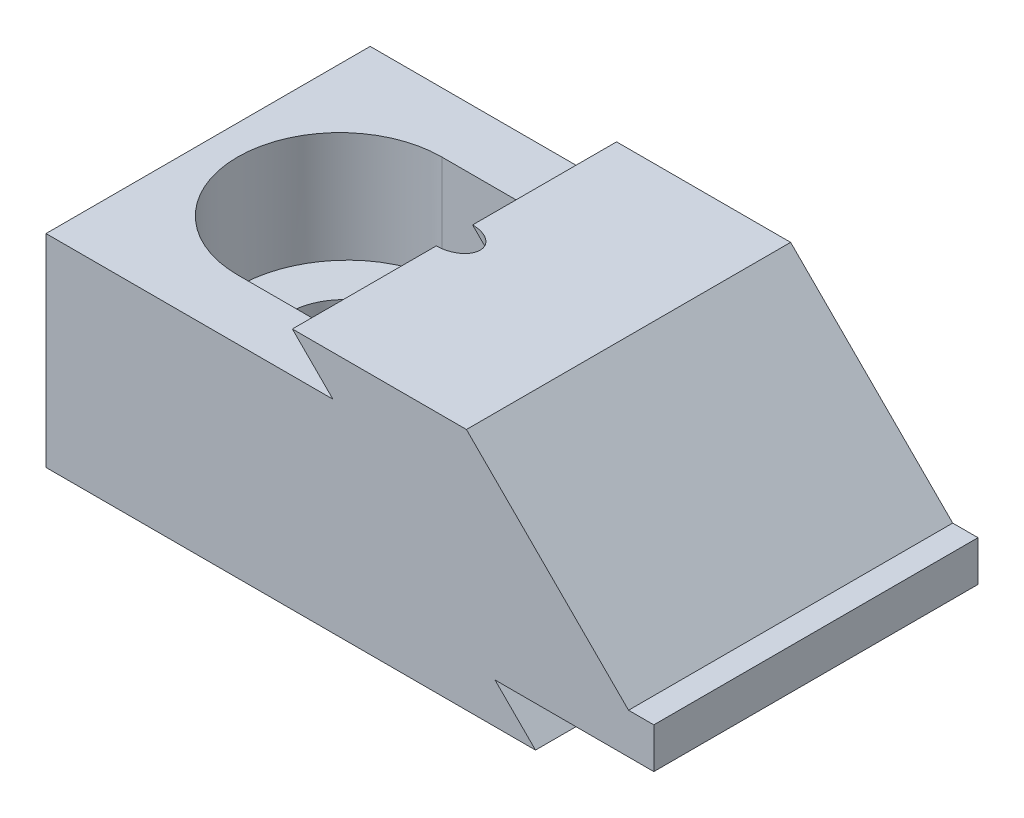
ISO-10303-21;
HEADER;
FILE_DESCRIPTION(('STEP AP214'),'2;1');
FILE_NAME('part.step','',(''),(''),'','','');
FILE_SCHEMA(('AUTOMOTIVE_DESIGN { 1 0 10303 214 1 1 1 1 }'));
ENDSEC;
DATA;
#1=APPLICATION_CONTEXT('core data for automotive mechanical design processes');
#2=APPLICATION_PROTOCOL_DEFINITION('international standard','automotive_design',2000,#1);
#3=PRODUCT_CONTEXT('',#1,'mechanical');
#4=PRODUCT('Part','Part','',(#3));
#5=PRODUCT_RELATED_PRODUCT_CATEGORY('part','',(#4));
#6=PRODUCT_DEFINITION_FORMATION('','',#4);
#7=PRODUCT_DEFINITION_CONTEXT('part definition',#1,'design');
#8=PRODUCT_DEFINITION('design','',#6,#7);
#9=PRODUCT_DEFINITION_SHAPE('','',#8);
#10=(LENGTH_UNIT() NAMED_UNIT(*) SI_UNIT(.MILLI.,.METRE.));
#11=(NAMED_UNIT(*) PLANE_ANGLE_UNIT() SI_UNIT($,.RADIAN.));
#12=(NAMED_UNIT(*) SI_UNIT($,.STERADIAN.) SOLID_ANGLE_UNIT());
#13=UNCERTAINTY_MEASURE_WITH_UNIT(LENGTH_MEASURE(1.E-05),#10,'distance_accuracy_value','');
#14=(GEOMETRIC_REPRESENTATION_CONTEXT(3) GLOBAL_UNCERTAINTY_ASSIGNED_CONTEXT((#13)) GLOBAL_UNIT_ASSIGNED_CONTEXT((#10,
#11,#12)) REPRESENTATION_CONTEXT('',''));
#15=CARTESIAN_POINT('',(0.,0.,0.));
#16=DIRECTION('',(0.,0.,1.));
#17=DIRECTION('',(1.,0.,0.));
#18=AXIS2_PLACEMENT_3D('',#15,#16,#17);
#19=CARTESIAN_POINT('',(39.3169802270047,-10.4879802270047,9.52499999999989));
#20=DIRECTION('',(-0.707106781186547,-0.707106781186548,0.));
#21=DIRECTION('',(-0.707106781186548,0.707106781186547,0.));
#22=AXIS2_PLACEMENT_3D('',#19,#20,#21);
#23=PLANE('',#22);
#24=DIRECTION('',(0.707106781186548,-0.707106781186547,0.));
#25=VECTOR('',#24,1.);
#26=CARTESIAN_POINT('',(9.65199999999986,19.1770000000001,8.1026000000002));
#27=LINE('',#26,#25);
#28=CARTESIAN_POINT('',(19.304,9.52500000000002,8.1026000000001));
#29=VERTEX_POINT('',#28);
#30=CARTESIAN_POINT('',(24.5359493419423,4.29305065805775,8.10260000000004));
#31=VERTEX_POINT('',#30);
#32=EDGE_CURVE('E520',#29,#31,#27,.T.);
#33=ORIENTED_EDGE('',*,*,#32,.F.);
#34=DIRECTION('',(0.,0.,1.));
#35=VECTOR('',#34,1.);
#36=CARTESIAN_POINT('',(19.304,9.525,9.5250000000001));
#37=LINE('',#36,#35);
#38=CARTESIAN_POINT('',(19.304,9.52500000000013,-3.1749999999999));
#39=VERTEX_POINT('',#38);
#40=EDGE_CURVE('E411',#39,#29,#37,.T.);
#41=ORIENTED_EDGE('',*,*,#40,.F.);
#42=DIRECTION('',(-0.707106781186548,0.707106781186547,0.));
#43=VECTOR('',#42,1.);
#44=CARTESIAN_POINT('',(33.2157401135023,-4.3867401135022,-3.17500000000005));
#45=LINE('',#44,#43);
#46=CARTESIAN_POINT('',(22.479,6.35000000000013,-3.17499999999993));
#47=VERTEX_POINT('',#46);
#48=EDGE_CURVE('E301',#47,#39,#45,.T.);
#49=ORIENTED_EDGE('',*,*,#48,.F.);
#50=DIRECTION('',(0.,0.,1.));
#51=VECTOR('',#50,1.);
#52=CARTESIAN_POINT('',(22.479,6.35,9.52500000000007));
#53=LINE('',#52,#51);
#54=CARTESIAN_POINT('',(22.479,6.35000000000006,4.03107922882035));
#55=VERTEX_POINT('',#54);
#56=EDGE_CURVE('E378',#47,#55,#53,.T.);
#57=ORIENTED_EDGE('',*,*,#56,.T.);
#58=CARTESIAN_POINT('',(24.6634,4.16560000000003,9.52500000000004));
#59=CARTESIAN_POINT('',(24.6634,4.16559999999995,17.526));
#60=CARTESIAN_POINT('',(16.6624,12.1665999999999,17.5260000000001));
#61=CARTESIAN_POINT('',(8.66140000000002,20.1675999999999,17.5260000000002));
#62=CARTESIAN_POINT('',(8.66140000000002,20.1676,9.52500000000021));
#63=CARTESIAN_POINT('',(8.66140000000002,20.1676000000001,1.52400000000022));
#64=CARTESIAN_POINT('',(16.6624,12.1666000000001,1.52400000000013));
#65=CARTESIAN_POINT('',(24.6634,4.16560000000012,1.52400000000005));
#66=CARTESIAN_POINT('',(24.6634,4.16560000000003,9.52500000000004));
#67=(BOUNDED_CURVE() B_SPLINE_CURVE(2,(#58,#59,#60,#61,#62,#63,#64,#65,#66),.UNSPECIFIED.,.T.,
.F.) B_SPLINE_CURVE_WITH_KNOTS((3,2,2,2,3),(0.,1.5707963267949,3.14159265358979,
4.71238898038469,6.28318530717959),
.UNSPECIFIED.) CURVE() GEOMETRIC_REPRESENTATION_ITEM() RATIONAL_B_SPLINE_CURVE((1.,
0.707106781186548,1.,0.707106781186548,1.,0.707106781186548,1.,0.707106781186548,1.)) REPRESENTATION_ITEM(''));
#68=EDGE_CURVE('E416',#55,#31,#67,.T.);
#69=ORIENTED_EDGE('',*,*,#68,.T.);
#70=EDGE_LOOP('',(#33,#41,#49,#57,#69));
#71=FACE_BOUND('',#70,.T.);
#72=ADVANCED_FACE('F40',(#71),#23,.T.);
#73=CARTESIAN_POINT('',(39.3169802270047,-10.4879802270047,9.52499999999989));
#74=DIRECTION('',(0.707106781186547,0.707106781186548,0.));
#75=DIRECTION('',(0.707106781186548,-0.707106781186547,0.));
#76=AXIS2_PLACEMENT_3D('',#73,#74,#75);
#77=PLANE('',#76);
#78=DIRECTION('',(0.707106781186548,-0.707106781186547,0.));
#79=VECTOR('',#78,1.);
#80=CARTESIAN_POINT('',(9.65199999999986,19.1770000000001,10.9474000000002));
#81=LINE('',#80,#79);
#82=CARTESIAN_POINT('',(35.179,-6.35000000000002,10.9473999999999));
#83=VERTEX_POINT('',#82);
#84=CARTESIAN_POINT('',(38.354,-9.52500000000002,10.9473999999999));
#85=VERTEX_POINT('',#84);
#86=EDGE_CURVE('E11',#83,#85,#81,.T.);
#87=ORIENTED_EDGE('',*,*,#86,.F.);
#88=DIRECTION('',(0.,0.,1.));
#89=VECTOR('',#88,1.);
#90=CARTESIAN_POINT('',(35.179,-6.35,9.52499999999993));
#91=LINE('',#90,#89);
#92=CARTESIAN_POINT('',(35.179,-6.35000000000013,22.2249999999999));
#93=VERTEX_POINT('',#92);
#94=EDGE_CURVE('E209',#83,#93,#91,.T.);
#95=ORIENTED_EDGE('',*,*,#94,.T.);
#96=DIRECTION('',(-0.707106781186548,0.707106781186547,0.));
#97=VECTOR('',#96,1.);
#98=CARTESIAN_POINT('',(33.2157401135023,-4.38674011350246,22.225));
#99=LINE('',#98,#97);
#100=CARTESIAN_POINT('',(38.354,-9.52500000000013,22.2249999999999));
#101=VERTEX_POINT('',#100);
#102=EDGE_CURVE('E239',#101,#93,#99,.T.);
#103=ORIENTED_EDGE('',*,*,#102,.F.);
#104=DIRECTION('',(0.,0.,1.));
#105=VECTOR('',#104,1.);
#106=CARTESIAN_POINT('',(38.354,-9.525,9.5249999999999));
#107=LINE('',#106,#105);
#108=EDGE_CURVE('E361',#85,#101,#107,.T.);
#109=ORIENTED_EDGE('',*,*,#108,.F.);
#110=EDGE_LOOP('',(#87,#95,#103,#109));
#111=FACE_BOUND('',#110,.T.);
#112=ADVANCED_FACE('F495',(#111),#77,.T.);
#113=CARTESIAN_POINT('',(16.6624,1.9558,9.52500000000002));
#114=DIRECTION('',(0.,-1.,0.));
#115=DIRECTION('',(-1.,0.,0.));
#116=AXIS2_PLACEMENT_3D('',#113,#114,#115);
#117=CYLINDRICAL_SURFACE('',#116,8.001);
#118=CARTESIAN_POINT('',(24.5359493419423,4.29305065805772,10.9474));
#119=VERTEX_POINT('',#118);
#120=CARTESIAN_POINT('',(22.479,6.34999999999994,15.0189207711798));
#121=VERTEX_POINT('',#120);
#122=EDGE_CURVE('E314',#119,#121,#67,.T.);
#123=ORIENTED_EDGE('',*,*,#122,.F.);
#124=CARTESIAN_POINT('',(24.6634,6.1771773711195,9.52500000000005));
#125=CARTESIAN_POINT('',(24.6633986205624,6.17717217984892,9.5926855994956));
#126=CARTESIAN_POINT('',(24.6625305522783,6.17116565727788,9.66044363604542));
#127=CARTESIAN_POINT('',(24.6591601716416,6.14745346384912,9.79389685806568));
#128=CARTESIAN_POINT('',(24.656655138053,6.12972831175996,9.85958841736439));
#129=CARTESIAN_POINT('',(24.6503189994246,6.08362152412297,9.98672425733501));
#130=CARTESIAN_POINT('',(24.6464932655129,6.05528301278802,10.0481845500187));
#131=CARTESIAN_POINT('',(24.6379195503495,5.98930519908397,10.1657582175707));
#132=CARTESIAN_POINT('',(24.6331716595099,5.95166680841399,10.2218721158177));
#133=CARTESIAN_POINT('',(24.622900448211,5.86619929146113,10.3309862250048));
#134=CARTESIAN_POINT('',(24.6173481573063,5.81790656059135,10.3836184643963));
#135=CARTESIAN_POINT('',(24.6061732344276,5.71438577287327,10.4815019477657));
#136=CARTESIAN_POINT('',(24.6005505646194,5.65915382759649,10.5267490204825));
#137=CARTESIAN_POINT('',(24.5870390114346,5.51584485200487,10.6295094438942));
#138=CARTESIAN_POINT('',(24.5793398078696,5.42461227732099,10.6826652210832));
#139=CARTESIAN_POINT('',(24.5655106974595,5.23464122260135,10.773577901115));
#140=CARTESIAN_POINT('',(24.5593842623451,5.13588675086171,10.8113008445498));
#141=CARTESIAN_POINT('',(24.5475282246709,4.90148221596709,10.8823805057908));
#142=CARTESIAN_POINT('',(24.5425609775113,4.7641871091411,10.9104242441436));
#143=CARTESIAN_POINT('',(24.5365085661564,4.48689214624602,10.9443921619761));
#144=CARTESIAN_POINT('',(24.5354270708076,4.34688985940966,10.9502954371193));
#145=CARTESIAN_POINT('',(24.5369522175559,4.0647160891458,10.9418429182653));
#146=CARTESIAN_POINT('',(24.5396343900309,3.92255846800791,10.9270722487442));
#147=CARTESIAN_POINT('',(24.5483113070187,3.64186637404091,10.8774225750246));
#148=CARTESIAN_POINT('',(24.55430617417,3.50333203554729,10.8425428263712));
#149=CARTESIAN_POINT('',(24.5679038669902,3.250784479431,10.7581194314505));
#150=CARTESIAN_POINT('',(24.5751970567133,3.13592216740057,10.7110662235777));
#151=CARTESIAN_POINT('',(24.5910306012216,2.91465644871868,10.6001665474936));
#152=CARTESIAN_POINT('',(24.5995686415548,2.80823789824961,10.5363510712828));
#153=CARTESIAN_POINT('',(24.6137359926377,2.64514573279505,10.4163209116244));
#154=CARTESIAN_POINT('',(24.6193034272609,2.58437645929057,10.365669873845));
#155=CARTESIAN_POINT('',(24.6301242770192,2.47079440668192,10.2560287275348));
#156=CARTESIAN_POINT('',(24.6353781326604,2.41797029981929,10.1970507283897));
#157=CARTESIAN_POINT('',(24.6439013245839,2.33463856165368,10.0853506392697));
#158=CARTESIAN_POINT('',(24.64734738897,2.30180115632212,10.0343926837339));
#159=CARTESIAN_POINT('',(24.6534310232295,2.24470678089904,9.92781223419513));
#160=CARTESIAN_POINT('',(24.6560697221849,2.22043782065244,9.8721963941581));
#161=CARTESIAN_POINT('',(24.6599160080746,2.18535825103267,9.76607102210789));
#162=CARTESIAN_POINT('',(24.6612796095422,2.17306799870739,9.7160600399568));
#163=CARTESIAN_POINT('',(24.6630577971557,2.15707607558413,9.61466541423045));
#164=CARTESIAN_POINT('',(24.6634729572863,2.15336921020848,9.5632826199195));
#165=CARTESIAN_POINT('',(24.6633057528824,2.15486670045246,9.4606144864634));
#166=CARTESIAN_POINT('',(24.6627226809195,2.16007737576436,9.40932924223879));
#167=CARTESIAN_POINT('',(24.6606265164157,2.17896096898583,9.30836428554829));
#168=CARTESIAN_POINT('',(24.6591128005752,2.19263955833269,9.2586856726173));
#169=CARTESIAN_POINT('',(24.6548713939314,2.23145281323356,9.15091038249013));
#170=CARTESIAN_POINT('',(24.651944222488,2.25850219081763,9.09351512446356));
#171=CARTESIAN_POINT('',(24.6452739126821,2.32153262587789,8.98393000772922));
#172=CARTESIAN_POINT('',(24.6415293913377,2.35752883617018,8.93174919287017));
#173=CARTESIAN_POINT('',(24.6318519922132,2.45322943867401,8.81164574618144));
#174=CARTESIAN_POINT('',(24.6256698664145,2.51647697854784,8.74658493438141));
#175=CARTESIAN_POINT('',(24.613084252222,2.65228624254783,8.62708921671955));
#176=CARTESIAN_POINT('',(24.6066803044666,2.72486825814951,8.57267813124421));
#177=CARTESIAN_POINT('',(24.5957214906646,2.85766056823678,8.48585909782111));
#178=CARTESIAN_POINT('',(24.5911000668359,2.91650805179981,8.45133396856835));
#179=CARTESIAN_POINT('',(24.5821896588014,3.03699317339177,8.38747236851377));
#180=CARTESIAN_POINT('',(24.5779008400868,3.09863217651726,8.35813847147794));
#181=CARTESIAN_POINT('',(24.565735432694,3.28681314987756,8.27748712144046));
#182=CARTESIAN_POINT('',(24.5585609913971,3.41660623097291,8.23352808625609));
#183=CARTESIAN_POINT('',(24.5466897330901,3.68595658985986,8.16291222137172));
#184=CARTESIAN_POINT('',(24.5420945108174,3.82569746140083,8.13695644207963));
#185=CARTESIAN_POINT('',(24.5364331633579,4.10752616614054,8.10518523541201));
#186=CARTESIAN_POINT('',(24.5353656416179,4.24961304820222,8.09936183794663));
#187=CARTESIAN_POINT('',(24.5370837994448,4.52249160593177,8.1088883315642));
#188=CARTESIAN_POINT('',(24.5395883478814,4.65333617641942,8.12269317438765));
#189=CARTESIAN_POINT('',(24.5479914400064,4.91117634594957,8.17071883810472));
#190=CARTESIAN_POINT('',(24.5538858810009,5.03817640267019,8.20491498180798));
#191=CARTESIAN_POINT('',(24.5667336597283,5.25266398674283,8.28456833530151));
#192=CARTESIAN_POINT('',(24.5730460691684,5.34204508363035,8.32501782116265));
#193=CARTESIAN_POINT('',(24.5868120532603,5.51319197491986,8.41956719378556));
#194=CARTESIAN_POINT('',(24.5942639064376,5.59496896281777,8.47364656707231));
#195=CARTESIAN_POINT('',(24.6080243330091,5.73254962223481,8.58398787259031));
#196=CARTESIAN_POINT('',(24.6142749749622,5.79031675297081,8.63780074202919));
#197=CARTESIAN_POINT('',(24.6264072758947,5.89631005329974,8.75428002509239));
#198=CARTESIAN_POINT('',(24.6322888966664,5.94453523604622,8.81694735331407));
#199=CARTESIAN_POINT('',(24.6430426722612,6.02932814713485,8.95065376970052));
#200=CARTESIAN_POINT('',(24.6479055019235,6.0657897082785,9.02176158747944));
#201=CARTESIAN_POINT('',(24.6558497736143,6.12405005770181,9.16975570196632));
#202=CARTESIAN_POINT('',(24.658936140176,6.1458894079485,9.24662535026095));
#203=CARTESIAN_POINT('',(24.6617231205979,6.16547972679719,9.35785350311524));
#204=CARTESIAN_POINT('',(24.6623496700805,6.16985808697208,9.39112206398123));
#205=CARTESIAN_POINT('',(24.6631884495066,6.17570818068987,9.45792115320462));
#206=CARTESIAN_POINT('',(24.6634006837173,6.17717994416921,9.49145167886033));
#207=CARTESIAN_POINT('',(24.6634,6.1771773711195,9.52500000000005));
#208=B_SPLINE_CURVE_WITH_KNOTS('',3,(#124,#125,#126,#127,#128,#129,#130,#131,#132,#133,#134,
#135,#136,#137,#138,#139,#140,#141,#142,#143,#144,#145,#146,#147,#148,#149,#150,#151,#152,#153,
#154,#155,#156,#157,#158,#159,#160,#161,#162,#163,#164,#165,#166,#167,#168,#169,#170,#171,#172,
#173,#174,#175,#176,#177,#178,#179,#180,#181,#182,#183,#184,#185,#186,#187,#188,#189,#190,#191,
#192,#193,#194,#195,#196,#197,#198,#199,#200,#201,#202,#203,#204,#205,#206,#207),.UNSPECIFIED.,
.T.,.F.,(4,2,2,2,2,2,2,2,2,2,2,2,2,2,2,2,2,2,2,2,2,2,2,2,2,2,2,2,2,2,2,2,2,2,2,2,2,2,2,2,2,4),
(0.,0.202918143112057,0.406174471588162,0.60861373401999,0.811033158504318,1.02516365722857,
1.2394146848862,1.55526166613081,1.8717999669997,2.2902170840879,2.70902915829412,
3.13636730232429,3.56372126778808,3.93561533582653,4.30682658524488,4.54411710298444,
4.78106603161818,4.96258425609587,5.14384745889959,5.29771658605907,5.45149256883696,
5.60537757487546,5.75936575801137,5.94887314414437,6.13870370329618,6.41004770099754,
6.6819918505507,6.88687629382362,7.09186203409294,7.5018786382796,7.92707959712711,
8.35211220638795,8.74548073243746,9.13837417426138,9.43228131153143,9.7257487221354,
9.96240626746262,10.1990882755857,10.4378501904833,10.675947005685,10.7765242805616,
10.8771005195391),.UNSPECIFIED.);
#209=EDGE_CURVE('E373',#119,#31,#208,.T.);
#210=ORIENTED_EDGE('',*,*,#209,.T.);
#211=ORIENTED_EDGE('',*,*,#68,.F.);
#212=CARTESIAN_POINT('',(16.6624,6.35,9.52500000000007));
#213=DIRECTION('',(0.,-1.,0.));
#214=DIRECTION('',(1.,0.,0.));
#215=AXIS2_PLACEMENT_3D('',#212,#213,#214);
#216=CIRCLE('',#215,8.001);
#217=CARTESIAN_POINT('',(16.6624,6.35000000000008,1.52400000000007));
#218=VERTEX_POINT('',#217);
#219=EDGE_CURVE('E261',#218,#55,#216,.T.);
#220=ORIENTED_EDGE('',*,*,#219,.F.);
#221=DIRECTION('',(0.,1.,0.));
#222=VECTOR('',#221,1.);
#223=CARTESIAN_POINT('',(16.6624,1.95580000000008,1.52400000000002));
#224=LINE('',#223,#222);
#225=CARTESIAN_POINT('',(16.6624,-1.68629595950899,1.52399999999998));
#226=VERTEX_POINT('',#225);
#227=EDGE_CURVE('E315',#226,#218,#224,.T.);
#228=ORIENTED_EDGE('',*,*,#227,.F.);
#229=CARTESIAN_POINT('',(24.6634,-1.26698131746545,9.52499999999999));
#230=CARTESIAN_POINT('',(24.6634,-1.26698131746554,17.526));
#231=CARTESIAN_POINT('',(16.6624,-1.68629595950915,17.526));
#232=CARTESIAN_POINT('',(8.6614,-2.10561060155277,17.526));
#233=CARTESIAN_POINT('',(8.6614,-2.10561060155269,9.52499999999998));
#234=CARTESIAN_POINT('',(8.6614,-2.1056106015526,1.52399999999998));
#235=CARTESIAN_POINT('',(16.6624,-1.68629595950899,1.52399999999999));
#236=CARTESIAN_POINT('',(24.6634,-1.26698131746537,1.52399999999999));
#237=CARTESIAN_POINT('',(24.6634,-1.26698131746545,9.52499999999999));
#238=(BOUNDED_CURVE() B_SPLINE_CURVE(2,(#229,#230,#231,#232,#233,#234,#235,#236,#237),
.UNSPECIFIED.,.T.,.F.) B_SPLINE_CURVE_WITH_KNOTS((3,2,2,2,3),(0.,1.5707963267949,
3.14159265358979,4.71238898038469,6.28318530717959),
.UNSPECIFIED.) CURVE() GEOMETRIC_REPRESENTATION_ITEM() RATIONAL_B_SPLINE_CURVE((1.,
0.707106781186548,1.,0.707106781186548,1.,0.707106781186548,1.,0.707106781186548,1.)) REPRESENTATION_ITEM(''));
#239=CARTESIAN_POINT('',(16.6624,-1.68629595950915,17.526));
#240=VERTEX_POINT('',#239);
#241=EDGE_CURVE('E201',#226,#240,#238,.T.);
#242=ORIENTED_EDGE('',*,*,#241,.T.);
#243=DIRECTION('',(0.,1.,0.));
#244=VECTOR('',#243,1.);
#245=CARTESIAN_POINT('',(16.6624,1.95579999999992,17.526));
#246=LINE('',#245,#244);
#247=CARTESIAN_POINT('',(16.6624,6.34999999999992,17.5260000000001));
#248=VERTEX_POINT('',#247);
#249=EDGE_CURVE('E306',#240,#248,#246,.T.);
#250=ORIENTED_EDGE('',*,*,#249,.T.);
#251=CARTESIAN_POINT('',(16.6624,6.35,9.52500000000007));
#252=DIRECTION('',(0.,-1.,0.));
#253=DIRECTION('',(1.,0.,0.));
#254=AXIS2_PLACEMENT_3D('',#251,#252,#253);
#255=CIRCLE('',#254,8.001);
#256=EDGE_CURVE('E252',#121,#248,#255,.T.);
#257=ORIENTED_EDGE('',*,*,#256,.F.);
#258=EDGE_LOOP('',(#123,#210,#211,#220,#228,#242,#250,#257));
#259=FACE_BOUND('',#258,.T.);
#260=ADVANCED_FACE('F443',(#259),#117,.F.);
#261=CARTESIAN_POINT('',(26.0912657963433,-1.19215004196489,9.52499999999999));
#262=DIRECTION('',(-0.0523359562429443,0.998629534754574,0.));
#263=DIRECTION('',(0.998629534754574,0.0523359562429443,0.));
#264=AXIS2_PLACEMENT_3D('',#261,#262,#263);
#265=PLANE('',#264);
#266=CARTESIAN_POINT('',(18.3134,-1.59977071591276,9.52499999999998));
#267=CARTESIAN_POINT('',(18.3134,-1.59977071591285,17.526));
#268=CARTESIAN_POINT('',(10.3124,-2.01908535795646,17.526));
#269=CARTESIAN_POINT('',(2.3114,-2.43840000000008,17.526));
#270=CARTESIAN_POINT('',(2.3114,-2.4384,9.52499999999997));
#271=CARTESIAN_POINT('',(2.3114,-2.43839999999991,1.52399999999998));
#272=CARTESIAN_POINT('',(10.3124,-2.0190853579563,1.52399999999998));
#273=CARTESIAN_POINT('',(18.3134,-1.59977071591268,1.52399999999999));
#274=CARTESIAN_POINT('',(18.3134,-1.59977071591276,9.52499999999998));
#275=(BOUNDED_CURVE() B_SPLINE_CURVE(2,(#266,#267,#268,#269,#270,#271,#272,#273,#274),
.UNSPECIFIED.,.T.,.F.) B_SPLINE_CURVE_WITH_KNOTS((3,2,2,2,3),(0.,1.5707963267949,
3.14159265358979,4.71238898038469,6.28318530717959),
.UNSPECIFIED.) CURVE() GEOMETRIC_REPRESENTATION_ITEM() RATIONAL_B_SPLINE_CURVE((1.,
0.707106781186548,1.,0.707106781186548,1.,0.707106781186548,1.,0.707106781186548,1.)) REPRESENTATION_ITEM(''));
#276=CARTESIAN_POINT('',(10.3124,-2.01908535795646,17.526));
#277=VERTEX_POINT('',#276);
#278=CARTESIAN_POINT('',(10.3124,-2.0190853579563,1.52399999999998));
#279=VERTEX_POINT('',#278);
#280=EDGE_CURVE('E381',#277,#279,#275,.T.);
#281=ORIENTED_EDGE('',*,*,#280,.F.);
#282=DIRECTION('',(-0.998629534754574,-0.0523359562429443,0.));
#283=VECTOR('',#282,1.);
#284=CARTESIAN_POINT('',(19.8888568171533,-1.51720452276951,17.526));
#285=LINE('',#284,#283);
#286=EDGE_CURVE('E232',#240,#277,#285,.T.);
#287=ORIENTED_EDGE('',*,*,#286,.F.);
#288=ORIENTED_EDGE('',*,*,#241,.F.);
#289=DIRECTION('',(0.998629534754574,0.0523359562429443,0.));
#290=VECTOR('',#289,1.);
#291=CARTESIAN_POINT('',(19.8888568171533,-1.51720452276935,1.52399999999998));
#292=LINE('',#291,#290);
#293=EDGE_CURVE('E310',#279,#226,#292,.T.);
#294=ORIENTED_EDGE('',*,*,#293,.F.);
#295=EDGE_LOOP('',(#281,#287,#288,#294));
#296=FACE_BOUND('',#295,.T.);
#297=DIRECTION('',(-0.998629534754574,-0.0523359562429443,0.));
#298=VECTOR('',#297,1.);
#299=CARTESIAN_POINT('',(19.7962628911792,-1.52205716480479,5.51179999999998));
#300=LINE('',#299,#298);
#301=CARTESIAN_POINT('',(16.6624,-1.68629595950903,5.51179999999998));
#302=VERTEX_POINT('',#301);
#303=CARTESIAN_POINT('',(10.3124,-2.01908535795634,5.51179999999998));
#304=VERTEX_POINT('',#303);
#305=EDGE_CURVE('E294',#302,#304,#300,.T.);
#306=ORIENTED_EDGE('',*,*,#305,.F.);
#307=CARTESIAN_POINT('',(20.6756,-1.47597305969037,9.52499999999998));
#308=CARTESIAN_POINT('',(20.6756,-1.47597305969033,5.51179999999998));
#309=CARTESIAN_POINT('',(16.6624,-1.68629595950903,5.51179999999998));
#310=CARTESIAN_POINT('',(12.6492,-1.89661885932773,5.51179999999998));
#311=CARTESIAN_POINT('',(12.6492,-1.89661885932777,9.52499999999998));
#312=CARTESIAN_POINT('',(12.6492,-1.89661885932782,13.5382));
#313=CARTESIAN_POINT('',(16.6624,-1.68629595950911,13.5382));
#314=CARTESIAN_POINT('',(20.6756,-1.47597305969041,13.5382));
#315=CARTESIAN_POINT('',(20.6756,-1.47597305969037,9.52499999999998));
#316=(BOUNDED_CURVE() B_SPLINE_CURVE(2,(#307,#308,#309,#310,#311,#312,#313,#314,#315),
.UNSPECIFIED.,.T.,.F.) B_SPLINE_CURVE_WITH_KNOTS((3,2,2,2,3),(0.,1.5707963267949,
3.14159265358979,4.71238898038469,6.28318530717959),
.UNSPECIFIED.) CURVE() GEOMETRIC_REPRESENTATION_ITEM() RATIONAL_B_SPLINE_CURVE((1.,
0.707106781186548,1.,0.707106781186548,1.,0.707106781186548,1.,0.707106781186548,1.)) REPRESENTATION_ITEM(''));
#317=CARTESIAN_POINT('',(16.6624,-1.68629595950911,13.5382));
#318=VERTEX_POINT('',#317);
#319=EDGE_CURVE('E295',#318,#302,#316,.T.);
#320=ORIENTED_EDGE('',*,*,#319,.F.);
#321=DIRECTION('',(0.998629534754574,0.0523359562429443,0.));
#322=VECTOR('',#321,1.);
#323=CARTESIAN_POINT('',(19.7962628911792,-1.52205716480487,13.5382));
#324=LINE('',#323,#322);
#325=CARTESIAN_POINT('',(10.3124,-2.01908535795642,13.5382));
#326=VERTEX_POINT('',#325);
#327=EDGE_CURVE('E283',#326,#318,#324,.T.);
#328=ORIENTED_EDGE('',*,*,#327,.F.);
#329=CARTESIAN_POINT('',(14.3256,-1.80876245813768,9.52499999999998));
#330=CARTESIAN_POINT('',(14.3256,-1.80876245813764,5.51179999999998));
#331=CARTESIAN_POINT('',(10.3124,-2.01908535795634,5.51179999999998));
#332=CARTESIAN_POINT('',(6.2992,-2.22940825777504,5.51179999999997));
#333=CARTESIAN_POINT('',(6.2992,-2.22940825777508,9.52499999999998));
#334=CARTESIAN_POINT('',(6.2992,-2.22940825777513,13.5382));
#335=CARTESIAN_POINT('',(10.3124,-2.01908535795642,13.5382));
#336=CARTESIAN_POINT('',(14.3256,-1.80876245813772,13.5382));
#337=CARTESIAN_POINT('',(14.3256,-1.80876245813768,9.52499999999998));
#338=(BOUNDED_CURVE() B_SPLINE_CURVE(2,(#329,#330,#331,#332,#333,#334,#335,#336,#337),
.UNSPECIFIED.,.T.,.F.) B_SPLINE_CURVE_WITH_KNOTS((3,2,2,2,3),(0.,1.5707963267949,
3.14159265358979,4.71238898038469,6.28318530717959),
.UNSPECIFIED.) CURVE() GEOMETRIC_REPRESENTATION_ITEM() RATIONAL_B_SPLINE_CURVE((1.,
0.707106781186548,1.,0.707106781186548,1.,0.707106781186548,1.,0.707106781186548,1.)) REPRESENTATION_ITEM(''));
#339=EDGE_CURVE('E284',#304,#326,#338,.T.);
#340=ORIENTED_EDGE('',*,*,#339,.F.);
#341=EDGE_LOOP('',(#306,#320,#328,#340));
#342=FACE_BOUND('',#341,.T.);
#343=ADVANCED_FACE('F484',(#296,#342),#265,.T.);
#344=CARTESIAN_POINT('',(13.4874,1.95579999999992,17.526));
#345=DIRECTION('',(0.,0.,-1.));
#346=DIRECTION('',(0.,1.,0.));
#347=AXIS2_PLACEMENT_3D('',#344,#345,#346);
#348=PLANE('',#347);
#349=ORIENTED_EDGE('',*,*,#286,.T.);
#350=DIRECTION('',(0.,1.,0.));
#351=VECTOR('',#350,1.);
#352=CARTESIAN_POINT('',(10.3124,1.95579999999992,17.526));
#353=LINE('',#352,#351);
#354=CARTESIAN_POINT('',(10.3124,6.34999999999992,17.5260000000001));
#355=VERTEX_POINT('',#354);
#356=EDGE_CURVE('E228',#277,#355,#353,.T.);
#357=ORIENTED_EDGE('',*,*,#356,.T.);
#358=DIRECTION('',(-1.,0.,0.));
#359=VECTOR('',#358,1.);
#360=CARTESIAN_POINT('',(18.64995,6.34999999999992,17.5260000000001));
#361=LINE('',#360,#359);
#362=EDGE_CURVE('E233',#248,#355,#361,.T.);
#363=ORIENTED_EDGE('',*,*,#362,.F.);
#364=ORIENTED_EDGE('',*,*,#249,.F.);
#365=EDGE_LOOP('',(#349,#357,#363,#364));
#366=FACE_BOUND('',#365,.T.);
#367=ADVANCED_FACE('F486',(#366),#348,.T.);
#368=CARTESIAN_POINT('',(23.8125,6.35,9.52500000000007));
#369=DIRECTION('',(0.,1.,0.));
#370=DIRECTION('',(1.,0.,0.));
#371=AXIS2_PLACEMENT_3D('',#368,#369,#370);
#372=PLANE('',#371);
#373=ORIENTED_EDGE('',*,*,#362,.T.);
#374=CARTESIAN_POINT('',(10.3124,6.35,9.52500000000007));
#375=DIRECTION('',(0.,-1.,0.));
#376=DIRECTION('',(1.,0.,0.));
#377=AXIS2_PLACEMENT_3D('',#374,#375,#376);
#378=CIRCLE('',#377,8.001);
#379=CARTESIAN_POINT('',(10.3124,6.35000000000008,1.52400000000007));
#380=VERTEX_POINT('',#379);
#381=EDGE_CURVE('E278',#355,#380,#378,.T.);
#382=ORIENTED_EDGE('',*,*,#381,.T.);
#383=DIRECTION('',(1.,0.,0.));
#384=VECTOR('',#383,1.);
#385=CARTESIAN_POINT('',(18.64995,6.35000000000008,1.52400000000007));
#386=LINE('',#385,#384);
#387=EDGE_CURVE('E274',#380,#218,#386,.T.);
#388=ORIENTED_EDGE('',*,*,#387,.T.);
#389=ORIENTED_EDGE('',*,*,#219,.T.);
#390=ORIENTED_EDGE('',*,*,#56,.F.);
#391=DIRECTION('',(-1.,0.,0.));
#392=VECTOR('',#391,1.);
#393=CARTESIAN_POINT('',(23.8125,6.35000000000013,-3.17499999999993));
#394=LINE('',#393,#392);
#395=CARTESIAN_POINT('',(0.,6.35000000000013,-3.17499999999993));
#396=VERTEX_POINT('',#395);
#397=EDGE_CURVE('E257',#47,#396,#394,.T.);
#398=ORIENTED_EDGE('',*,*,#397,.T.);
#399=DIRECTION('',(0.,0.,1.));
#400=VECTOR('',#399,1.);
#401=CARTESIAN_POINT('',(0.,6.35,9.52500000000007));
#402=LINE('',#401,#400);
#403=CARTESIAN_POINT('',(0.,6.34999999999987,22.2250000000001));
#404=VERTEX_POINT('',#403);
#405=EDGE_CURVE('E262',#396,#404,#402,.T.);
#406=ORIENTED_EDGE('',*,*,#405,.T.);
#407=DIRECTION('',(1.,0.,0.));
#408=VECTOR('',#407,1.);
#409=CARTESIAN_POINT('',(23.8125,6.34999999999987,22.2250000000001));
#410=LINE('',#409,#408);
#411=CARTESIAN_POINT('',(22.479,6.34999999999987,22.2250000000001));
#412=VERTEX_POINT('',#411);
#413=EDGE_CURVE('E255',#404,#412,#410,.T.);
#414=ORIENTED_EDGE('',*,*,#413,.T.);
#415=DIRECTION('',(0.,0.,1.));
#416=VECTOR('',#415,1.);
#417=CARTESIAN_POINT('',(22.479,6.35,9.52500000000007));
#418=LINE('',#417,#416);
#419=EDGE_CURVE('E256',#121,#412,#418,.T.);
#420=ORIENTED_EDGE('',*,*,#419,.F.);
#421=ORIENTED_EDGE('',*,*,#256,.T.);
#422=EDGE_LOOP('',(#373,#382,#388,#389,#390,#398,#406,#414,#420,#421));
#423=FACE_BOUND('',#422,.T.);
#424=ADVANCED_FACE('F437',(#423),#372,.T.);
#425=DIRECTION('',(0.707106781186548,-0.707106781186547,0.));
#426=VECTOR('',#425,1.);
#427=CARTESIAN_POINT('',(9.65199999999986,19.1770000000001,10.9474000000002));
#428=LINE('',#427,#426);
#429=CARTESIAN_POINT('',(19.304,9.52499999999998,10.9474000000001));
#430=VERTEX_POINT('',#429);
#431=EDGE_CURVE('E56',#119,#430,#428,.F.);
#432=ORIENTED_EDGE('',*,*,#431,.F.);
#433=ORIENTED_EDGE('',*,*,#122,.T.);
#434=ORIENTED_EDGE('',*,*,#419,.T.);
#435=DIRECTION('',(0.707106781186548,-0.707106781186547,0.));
#436=VECTOR('',#435,1.);
#437=CARTESIAN_POINT('',(33.2157401135023,-4.38674011350246,22.225));
#438=LINE('',#437,#436);
#439=CARTESIAN_POINT('',(19.304,9.52499999999987,22.2250000000001));
#440=VERTEX_POINT('',#439);
#441=EDGE_CURVE('E238',#440,#412,#438,.T.);
#442=ORIENTED_EDGE('',*,*,#441,.F.);
#443=EDGE_CURVE('E415',#430,#440,#37,.T.);
#444=ORIENTED_EDGE('',*,*,#443,.F.);
#445=EDGE_LOOP('',(#432,#433,#434,#442,#444));
#446=FACE_BOUND('',#445,.T.);
#447=ADVANCED_FACE('F500',(#446),#23,.T.);
#448=CARTESIAN_POINT('',(13.4874,1.95580000000008,1.52400000000002));
#449=DIRECTION('',(0.,0.,1.));
#450=DIRECTION('',(0.,-1.,0.));
#451=AXIS2_PLACEMENT_3D('',#448,#449,#450);
#452=PLANE('',#451);
#453=ORIENTED_EDGE('',*,*,#293,.T.);
#454=ORIENTED_EDGE('',*,*,#227,.T.);
#455=ORIENTED_EDGE('',*,*,#387,.F.);
#456=DIRECTION('',(0.,1.,0.));
#457=VECTOR('',#456,1.);
#458=CARTESIAN_POINT('',(10.3124,1.95580000000008,1.52400000000002));
#459=LINE('',#458,#457);
#460=EDGE_CURVE('E270',#279,#380,#459,.T.);
#461=ORIENTED_EDGE('',*,*,#460,.F.);
#462=EDGE_LOOP('',(#453,#454,#455,#461));
#463=FACE_BOUND('',#462,.T.);
#464=ADVANCED_FACE('F509',(#463),#452,.T.);
#465=CARTESIAN_POINT('',(13.4874,-1.58749999999996,5.51179999999998));
#466=DIRECTION('',(0.,0.,1.));
#467=DIRECTION('',(0.,-1.,0.));
#468=AXIS2_PLACEMENT_3D('',#465,#466,#467);
#469=PLANE('',#468);
#470=ORIENTED_EDGE('',*,*,#305,.T.);
#471=DIRECTION('',(0.,1.,0.));
#472=VECTOR('',#471,1.);
#473=CARTESIAN_POINT('',(10.3124,-1.58749999999996,5.51179999999998));
#474=LINE('',#473,#472);
#475=CARTESIAN_POINT('',(10.3124,-9.52499999999996,5.5117999999999));
#476=VERTEX_POINT('',#475);
#477=EDGE_CURVE('E346',#476,#304,#474,.T.);
#478=ORIENTED_EDGE('',*,*,#477,.F.);
#479=DIRECTION('',(-1.,0.,0.));
#480=VECTOR('',#479,1.);
#481=CARTESIAN_POINT('',(18.64995,-9.52499999999996,5.5117999999999));
#482=LINE('',#481,#480);
#483=CARTESIAN_POINT('',(16.6624,-9.52499999999996,5.5117999999999));
#484=VERTEX_POINT('',#483);
#485=EDGE_CURVE('E245',#484,#476,#482,.T.);
#486=ORIENTED_EDGE('',*,*,#485,.F.);
#487=DIRECTION('',(0.,1.,0.));
#488=VECTOR('',#487,1.);
#489=CARTESIAN_POINT('',(16.6624,-1.58749999999996,5.51179999999998));
#490=LINE('',#489,#488);
#491=EDGE_CURVE('E290',#484,#302,#490,.T.);
#492=ORIENTED_EDGE('',*,*,#491,.T.);
#493=EDGE_LOOP('',(#470,#478,#486,#492));
#494=FACE_BOUND('',#493,.T.);
#495=ADVANCED_FACE('F472',(#494),#469,.T.);
#496=CARTESIAN_POINT('',(16.6624,-1.5875,9.52499999999998));
#497=DIRECTION('',(0.,-1.,0.));
#498=DIRECTION('',(-1.,0.,0.));
#499=AXIS2_PLACEMENT_3D('',#496,#497,#498);
#500=CYLINDRICAL_SURFACE('',#499,4.0132);
#501=CARTESIAN_POINT('',(16.6624,-9.525,9.5249999999999));
#502=DIRECTION('',(0.,1.,0.));
#503=DIRECTION('',(1.,0.,0.));
#504=AXIS2_PLACEMENT_3D('',#501,#502,#503);
#505=CIRCLE('',#504,4.0132);
#506=CARTESIAN_POINT('',(16.6624,-9.52500000000004,13.5381999999999));
#507=VERTEX_POINT('',#506);
#508=EDGE_CURVE('E240',#507,#484,#505,.T.);
#509=ORIENTED_EDGE('',*,*,#508,.F.);
#510=DIRECTION('',(0.,1.,0.));
#511=VECTOR('',#510,1.);
#512=CARTESIAN_POINT('',(16.6624,-1.58750000000004,13.5382));
#513=LINE('',#512,#511);
#514=EDGE_CURVE('E338',#507,#318,#513,.T.);
#515=ORIENTED_EDGE('',*,*,#514,.T.);
#516=ORIENTED_EDGE('',*,*,#319,.T.);
#517=ORIENTED_EDGE('',*,*,#491,.F.);
#518=EDGE_LOOP('',(#509,#515,#516,#517));
#519=FACE_BOUND('',#518,.T.);
#520=ADVANCED_FACE('F482',(#519),#500,.F.);
#521=CARTESIAN_POINT('',(13.4874,-1.58750000000004,13.5382));
#522=DIRECTION('',(0.,0.,-1.));
#523=DIRECTION('',(0.,1.,0.));
#524=AXIS2_PLACEMENT_3D('',#521,#522,#523);
#525=PLANE('',#524);
#526=ORIENTED_EDGE('',*,*,#327,.T.);
#527=ORIENTED_EDGE('',*,*,#514,.F.);
#528=DIRECTION('',(1.,0.,0.));
#529=VECTOR('',#528,1.);
#530=CARTESIAN_POINT('',(18.64995,-9.52500000000004,13.5381999999999));
#531=LINE('',#530,#529);
#532=CARTESIAN_POINT('',(10.3124,-9.52500000000004,13.5381999999999));
#533=VERTEX_POINT('',#532);
#534=EDGE_CURVE('E244',#533,#507,#531,.T.);
#535=ORIENTED_EDGE('',*,*,#534,.F.);
#536=DIRECTION('',(0.,1.,0.));
#537=VECTOR('',#536,1.);
#538=CARTESIAN_POINT('',(10.3124,-1.58750000000004,13.5382));
#539=LINE('',#538,#537);
#540=EDGE_CURVE('E279',#533,#326,#539,.T.);
#541=ORIENTED_EDGE('',*,*,#540,.T.);
#542=EDGE_LOOP('',(#526,#527,#535,#541));
#543=FACE_BOUND('',#542,.T.);
#544=ADVANCED_FACE('F480',(#543),#525,.T.);
#545=CARTESIAN_POINT('',(10.3124,-1.5875,9.52499999999998));
#546=DIRECTION('',(0.,-1.,0.));
#547=DIRECTION('',(-1.,0.,0.));
#548=AXIS2_PLACEMENT_3D('',#545,#546,#547);
#549=CYLINDRICAL_SURFACE('',#548,4.0132);
#550=ORIENTED_EDGE('',*,*,#540,.F.);
#551=CARTESIAN_POINT('',(10.3124,-9.525,9.5249999999999));
#552=DIRECTION('',(0.,1.,0.));
#553=DIRECTION('',(1.,0.,0.));
#554=AXIS2_PLACEMENT_3D('',#551,#552,#553);
#555=CIRCLE('',#554,4.0132);
#556=EDGE_CURVE('E360',#476,#533,#555,.T.);
#557=ORIENTED_EDGE('',*,*,#556,.F.);
#558=ORIENTED_EDGE('',*,*,#477,.T.);
#559=ORIENTED_EDGE('',*,*,#339,.T.);
#560=EDGE_LOOP('',(#550,#557,#558,#559));
#561=FACE_BOUND('',#560,.T.);
#562=ADVANCED_FACE('F475',(#561),#549,.F.);
#563=CARTESIAN_POINT('',(10.3124,1.9558,9.52500000000002));
#564=DIRECTION('',(0.,-1.,0.));
#565=DIRECTION('',(-1.,0.,0.));
#566=AXIS2_PLACEMENT_3D('',#563,#564,#565);
#567=CYLINDRICAL_SURFACE('',#566,8.001);
#568=ORIENTED_EDGE('',*,*,#280,.T.);
#569=ORIENTED_EDGE('',*,*,#460,.T.);
#570=ORIENTED_EDGE('',*,*,#381,.F.);
#571=ORIENTED_EDGE('',*,*,#356,.F.);
#572=EDGE_LOOP('',(#568,#569,#570,#571));
#573=FACE_BOUND('',#572,.T.);
#574=ADVANCED_FACE('F42',(#573),#567,.F.);
#575=CARTESIAN_POINT('',(23.8125,-1.58749999999987,-3.17500000000002));
#576=DIRECTION('',(0.,0.,-1.));
#577=DIRECTION('',(0.,1.,0.));
#578=AXIS2_PLACEMENT_3D('',#575,#576,#577);
#579=PLANE('',#578);
#580=DIRECTION('',(-1.,0.,0.));
#581=VECTOR('',#580,1.);
#582=CARTESIAN_POINT('',(23.8125,-6.34999999999987,-3.17500000000007));
#583=LINE('',#582,#581);
#584=CARTESIAN_POINT('',(47.625,-6.34999999999987,-3.17500000000007));
#585=VERTEX_POINT('',#584);
#586=CARTESIAN_POINT('',(35.179,-6.34999999999987,-3.17500000000007));
#587=VERTEX_POINT('',#586);
#588=EDGE_CURVE('E267',#585,#587,#583,.T.);
#589=ORIENTED_EDGE('',*,*,#588,.T.);
#590=DIRECTION('',(0.707106781186548,-0.707106781186547,0.));
#591=VECTOR('',#590,1.);
#592=CARTESIAN_POINT('',(33.2157401135023,-4.3867401135022,-3.17500000000005));
#593=LINE('',#592,#591);
#594=CARTESIAN_POINT('',(38.354,-9.52499999999987,-3.1750000000001));
#595=VERTEX_POINT('',#594);
#596=EDGE_CURVE('E215',#587,#595,#593,.T.);
#597=ORIENTED_EDGE('',*,*,#596,.T.);
#598=DIRECTION('',(1.,0.,0.));
#599=VECTOR('',#598,1.);
#600=CARTESIAN_POINT('',(23.8125,-9.52499999999987,-3.1750000000001));
#601=LINE('',#600,#599);
#602=CARTESIAN_POINT('',(0.,-9.52499999999987,-3.1750000000001));
#603=VERTEX_POINT('',#602);
#604=EDGE_CURVE('E217',#603,#595,#601,.T.);
#605=ORIENTED_EDGE('',*,*,#604,.F.);
#606=DIRECTION('',(0.,-1.,0.));
#607=VECTOR('',#606,1.);
#608=CARTESIAN_POINT('',(0.,-1.58749999999987,-3.17500000000002));
#609=LINE('',#608,#607);
#610=EDGE_CURVE('E251',#396,#603,#609,.T.);
#611=ORIENTED_EDGE('',*,*,#610,.F.);
#612=ORIENTED_EDGE('',*,*,#397,.F.);
#613=ORIENTED_EDGE('',*,*,#48,.T.);
#614=DIRECTION('',(-1.,0.,0.));
#615=VECTOR('',#614,1.);
#616=CARTESIAN_POINT('',(23.8125,9.52500000000013,-3.1749999999999));
#617=LINE('',#616,#615);
#618=CARTESIAN_POINT('',(32.9438,9.52500000000013,-3.1749999999999));
#619=VERTEX_POINT('',#618);
#620=EDGE_CURVE('E319',#619,#39,#617,.T.);
#621=ORIENTED_EDGE('',*,*,#620,.F.);
#622=DIRECTION('',(0.707106781186548,-0.707106781186547,0.));
#623=VECTOR('',#622,1.);
#624=CARTESIAN_POINT('',(36.6141,5.85470000000013,-3.17499999999994));
#625=LINE('',#624,#623);
#626=CARTESIAN_POINT('',(45.6438,-3.17499999999987,-3.17500000000003));
#627=VERTEX_POINT('',#626);
#628=EDGE_CURVE('E320',#619,#627,#625,.T.);
#629=ORIENTED_EDGE('',*,*,#628,.T.);
#630=DIRECTION('',(1.,0.,0.));
#631=VECTOR('',#630,1.);
#632=CARTESIAN_POINT('',(35.22345,-3.17499999999987,-3.17500000000003));
#633=LINE('',#632,#631);
#634=CARTESIAN_POINT('',(47.625,-3.17499999999987,-3.17500000000003));
#635=VERTEX_POINT('',#634);
#636=EDGE_CURVE('E250',#627,#635,#633,.T.);
#637=ORIENTED_EDGE('',*,*,#636,.T.);
#638=DIRECTION('',(0.,-1.,0.));
#639=VECTOR('',#638,1.);
#640=CARTESIAN_POINT('',(47.625,1.58750000000013,-3.17499999999998));
#641=LINE('',#640,#639);
#642=EDGE_CURVE('E246',#635,#585,#641,.T.);
#643=ORIENTED_EDGE('',*,*,#642,.T.);
#644=EDGE_LOOP('',(#589,#597,#605,#611,#612,#613,#621,#629,#637,#643));
#645=FACE_BOUND('',#644,.T.);
#646=ADVANCED_FACE('F528',(#645),#579,.T.);
#647=CARTESIAN_POINT('',(0.,-1.5875,9.52499999999998));
#648=DIRECTION('',(-1.,0.,0.));
#649=DIRECTION('',(0.,1.,0.));
#650=AXIS2_PLACEMENT_3D('',#647,#648,#649);
#651=PLANE('',#650);
#652=DIRECTION('',(0.,-1.,0.));
#653=VECTOR('',#652,1.);
#654=CARTESIAN_POINT('',(0.,-1.58750000000013,22.225));
#655=LINE('',#654,#653);
#656=CARTESIAN_POINT('',(0.,-9.52500000000013,22.2249999999999));
#657=VERTEX_POINT('',#656);
#658=EDGE_CURVE('E234',#404,#657,#655,.T.);
#659=ORIENTED_EDGE('',*,*,#658,.F.);
#660=ORIENTED_EDGE('',*,*,#405,.F.);
#661=ORIENTED_EDGE('',*,*,#610,.T.);
#662=DIRECTION('',(0.,0.,-1.));
#663=VECTOR('',#662,1.);
#664=CARTESIAN_POINT('',(0.,-9.525,9.5249999999999));
#665=LINE('',#664,#663);
#666=EDGE_CURVE('E221',#657,#603,#665,.T.);
#667=ORIENTED_EDGE('',*,*,#666,.F.);
#668=EDGE_LOOP('',(#659,#660,#661,#667));
#669=FACE_BOUND('',#668,.T.);
#670=ADVANCED_FACE('F533',(#669),#651,.T.);
#671=CARTESIAN_POINT('',(23.8125,-1.58750000000013,22.225));
#672=DIRECTION('',(0.,0.,1.));
#673=DIRECTION('',(0.,-1.,0.));
#674=AXIS2_PLACEMENT_3D('',#671,#672,#673);
#675=PLANE('',#674);
#676=DIRECTION('',(1.,0.,0.));
#677=VECTOR('',#676,1.);
#678=CARTESIAN_POINT('',(23.8125,-6.35000000000013,22.2249999999999));
#679=LINE('',#678,#677);
#680=CARTESIAN_POINT('',(47.625,-6.35000000000013,22.2249999999999));
#681=VERTEX_POINT('',#680);
#682=EDGE_CURVE('E305',#93,#681,#679,.T.);
#683=ORIENTED_EDGE('',*,*,#682,.T.);
#684=DIRECTION('',(0.,-1.,0.));
#685=VECTOR('',#684,1.);
#686=CARTESIAN_POINT('',(47.625,-1.58750000000013,22.225));
#687=LINE('',#686,#685);
#688=CARTESIAN_POINT('',(47.625,-3.17500000000013,22.225));
#689=VERTEX_POINT('',#688);
#690=EDGE_CURVE('E368',#689,#681,#687,.T.);
#691=ORIENTED_EDGE('',*,*,#690,.F.);
#692=DIRECTION('',(-1.,0.,0.));
#693=VECTOR('',#692,1.);
#694=CARTESIAN_POINT('',(35.22345,-3.17500000000013,22.225));
#695=LINE('',#694,#693);
#696=CARTESIAN_POINT('',(45.6438,-3.17500000000013,22.225));
#697=VERTEX_POINT('',#696);
#698=EDGE_CURVE('E289',#689,#697,#695,.T.);
#699=ORIENTED_EDGE('',*,*,#698,.T.);
#700=DIRECTION('',(-0.707106781186548,0.707106781186547,0.));
#701=VECTOR('',#700,1.);
#702=CARTESIAN_POINT('',(36.6141,5.85469999999987,22.2250000000001));
#703=LINE('',#702,#701);
#704=CARTESIAN_POINT('',(32.9438,9.52499999999987,22.2250000000001));
#705=VERTEX_POINT('',#704);
#706=EDGE_CURVE('E285',#697,#705,#703,.T.);
#707=ORIENTED_EDGE('',*,*,#706,.T.);
#708=DIRECTION('',(1.,0.,0.));
#709=VECTOR('',#708,1.);
#710=CARTESIAN_POINT('',(23.8125,9.52499999999987,22.2250000000001));
#711=LINE('',#710,#709);
#712=EDGE_CURVE('E226',#440,#705,#711,.T.);
#713=ORIENTED_EDGE('',*,*,#712,.F.);
#714=ORIENTED_EDGE('',*,*,#441,.T.);
#715=ORIENTED_EDGE('',*,*,#413,.F.);
#716=ORIENTED_EDGE('',*,*,#658,.T.);
#717=DIRECTION('',(-1.,0.,0.));
#718=VECTOR('',#717,1.);
#719=CARTESIAN_POINT('',(23.8125,-9.52500000000013,22.2249999999999));
#720=LINE('',#719,#718);
#721=EDGE_CURVE('E266',#101,#657,#720,.T.);
#722=ORIENTED_EDGE('',*,*,#721,.F.);
#723=ORIENTED_EDGE('',*,*,#102,.T.);
#724=EDGE_LOOP('',(#683,#691,#699,#707,#713,#714,#715,#716,#722,#723));
#725=FACE_BOUND('',#724,.T.);
#726=ADVANCED_FACE('F577',(#725),#675,.T.);
#727=CARTESIAN_POINT('',(23.8125,9.525,9.5250000000001));
#728=DIRECTION('',(0.,1.,0.));
#729=DIRECTION('',(1.,0.,0.));
#730=AXIS2_PLACEMENT_3D('',#727,#728,#729);
#731=PLANE('',#730);
#732=CARTESIAN_POINT('',(19.304,9.525,9.5250000000001));
#733=DIRECTION('',(0.,1.,0.));
#734=DIRECTION('',(1.,0.,0.));
#735=AXIS2_PLACEMENT_3D('',#732,#733,#734);
#736=ELLIPSE('',#735,2.01157737111949,1.4224);
#737=EDGE_CURVE('E521',#430,#29,#736,.T.);
#738=ORIENTED_EDGE('',*,*,#737,.F.);
#739=ORIENTED_EDGE('',*,*,#443,.T.);
#740=ORIENTED_EDGE('',*,*,#712,.T.);
#741=DIRECTION('',(0.,0.,-1.));
#742=VECTOR('',#741,1.);
#743=CARTESIAN_POINT('',(32.9438,9.525,9.5250000000001));
#744=LINE('',#743,#742);
#745=EDGE_CURVE('E347',#705,#619,#744,.T.);
#746=ORIENTED_EDGE('',*,*,#745,.T.);
#747=ORIENTED_EDGE('',*,*,#620,.T.);
#748=ORIENTED_EDGE('',*,*,#40,.T.);
#749=EDGE_LOOP('',(#738,#739,#740,#746,#747,#748));
#750=FACE_BOUND('',#749,.T.);
#751=ADVANCED_FACE('F570',(#750),#731,.T.);
#752=CARTESIAN_POINT('',(23.8125,-9.525,9.5249999999999));
#753=DIRECTION('',(0.,-1.,0.));
#754=DIRECTION('',(-1.,0.,0.));
#755=AXIS2_PLACEMENT_3D('',#752,#753,#754);
#756=PLANE('',#755);
#757=CARTESIAN_POINT('',(38.354,-9.525,9.5249999999999));
#758=DIRECTION('',(0.,-1.,0.));
#759=DIRECTION('',(1.,0.,0.));
#760=AXIS2_PLACEMENT_3D('',#757,#758,#759);
#761=ELLIPSE('',#760,2.01157737111949,1.4224);
#762=CARTESIAN_POINT('',(38.354,-9.52499999999998,8.10259999999992));
#763=VERTEX_POINT('',#762);
#764=EDGE_CURVE('E63',#85,#763,#761,.T.);
#765=ORIENTED_EDGE('',*,*,#764,.F.);
#766=ORIENTED_EDGE('',*,*,#108,.T.);
#767=ORIENTED_EDGE('',*,*,#721,.T.);
#768=ORIENTED_EDGE('',*,*,#666,.T.);
#769=ORIENTED_EDGE('',*,*,#604,.T.);
#770=EDGE_CURVE('E357',#595,#763,#107,.T.);
#771=ORIENTED_EDGE('',*,*,#770,.T.);
#772=EDGE_LOOP('',(#765,#766,#767,#768,#769,#771));
#773=FACE_BOUND('',#772,.T.);
#774=ORIENTED_EDGE('',*,*,#534,.T.);
#775=ORIENTED_EDGE('',*,*,#508,.T.);
#776=ORIENTED_EDGE('',*,*,#485,.T.);
#777=ORIENTED_EDGE('',*,*,#556,.T.);
#778=EDGE_LOOP('',(#774,#775,#776,#777));
#779=FACE_BOUND('',#778,.T.);
#780=ADVANCED_FACE('F468',(#773,#779),#756,.T.);
#781=CARTESIAN_POINT('',(23.8125,-6.35,9.52499999999993));
#782=DIRECTION('',(0.,-1.,0.));
#783=DIRECTION('',(-1.,0.,0.));
#784=AXIS2_PLACEMENT_3D('',#781,#782,#783);
#785=PLANE('',#784);
#786=CARTESIAN_POINT('',(35.179,-6.35,9.52499999999993));
#787=DIRECTION('',(0.,-1.,0.));
#788=DIRECTION('',(1.,0.,0.));
#789=AXIS2_PLACEMENT_3D('',#786,#787,#788);
#790=ELLIPSE('',#789,2.01157737111949,1.4224);
#791=CARTESIAN_POINT('',(35.179,-6.34999999999996,8.10259999999993));
#792=VERTEX_POINT('',#791);
#793=EDGE_CURVE('E194',#792,#83,#790,.T.);
#794=ORIENTED_EDGE('',*,*,#793,.F.);
#795=EDGE_CURVE('E206',#587,#792,#91,.T.);
#796=ORIENTED_EDGE('',*,*,#795,.F.);
#797=ORIENTED_EDGE('',*,*,#588,.F.);
#798=DIRECTION('',(0.,0.,-1.));
#799=VECTOR('',#798,1.);
#800=CARTESIAN_POINT('',(47.625,-6.35,9.52499999999993));
#801=LINE('',#800,#799);
#802=EDGE_CURVE('E273',#681,#585,#801,.T.);
#803=ORIENTED_EDGE('',*,*,#802,.F.);
#804=ORIENTED_EDGE('',*,*,#682,.F.);
#805=ORIENTED_EDGE('',*,*,#94,.F.);
#806=EDGE_LOOP('',(#794,#796,#797,#803,#804,#805));
#807=FACE_BOUND('',#806,.T.);
#808=ADVANCED_FACE('F204',(#807),#785,.T.);
#809=DIRECTION('',(0.707106781186548,-0.707106781186547,0.));
#810=VECTOR('',#809,1.);
#811=CARTESIAN_POINT('',(9.65199999999986,19.1770000000001,8.1026000000002));
#812=LINE('',#811,#810);
#813=EDGE_CURVE('E49',#763,#792,#812,.F.);
#814=ORIENTED_EDGE('',*,*,#813,.F.);
#815=ORIENTED_EDGE('',*,*,#770,.F.);
#816=ORIENTED_EDGE('',*,*,#596,.F.);
#817=ORIENTED_EDGE('',*,*,#795,.T.);
#818=EDGE_LOOP('',(#814,#815,#816,#817));
#819=FACE_BOUND('',#818,.T.);
#820=ADVANCED_FACE('F213',(#819),#77,.T.);
#821=CARTESIAN_POINT('',(39.2938,3.175,9.52500000000003));
#822=DIRECTION('',(0.707106781186547,0.707106781186548,0.));
#823=DIRECTION('',(0.707106781186548,-0.707106781186547,0.));
#824=AXIS2_PLACEMENT_3D('',#821,#822,#823);
#825=PLANE('',#824);
#826=ORIENTED_EDGE('',*,*,#628,.F.);
#827=ORIENTED_EDGE('',*,*,#745,.F.);
#828=ORIENTED_EDGE('',*,*,#706,.F.);
#829=DIRECTION('',(0.,0.,-1.));
#830=VECTOR('',#829,1.);
#831=CARTESIAN_POINT('',(45.6438,-3.175,9.52499999999997));
#832=LINE('',#831,#830);
#833=EDGE_CURVE('E223',#697,#627,#832,.T.);
#834=ORIENTED_EDGE('',*,*,#833,.T.);
#835=EDGE_LOOP('',(#826,#827,#828,#834));
#836=FACE_BOUND('',#835,.T.);
#837=ADVANCED_FACE('F560',(#836),#825,.T.);
#838=CARTESIAN_POINT('',(46.6344,-3.175,9.52499999999997));
#839=DIRECTION('',(0.,1.,0.));
#840=DIRECTION('',(1.,0.,0.));
#841=AXIS2_PLACEMENT_3D('',#838,#839,#840);
#842=PLANE('',#841);
#843=DIRECTION('',(0.,0.,1.));
#844=VECTOR('',#843,1.);
#845=CARTESIAN_POINT('',(47.625,-3.175,9.52499999999997));
#846=LINE('',#845,#844);
#847=EDGE_CURVE('E372',#635,#689,#846,.T.);
#848=ORIENTED_EDGE('',*,*,#847,.F.);
#849=ORIENTED_EDGE('',*,*,#636,.F.);
#850=ORIENTED_EDGE('',*,*,#833,.F.);
#851=ORIENTED_EDGE('',*,*,#698,.F.);
#852=EDGE_LOOP('',(#848,#849,#850,#851));
#853=FACE_BOUND('',#852,.T.);
#854=ADVANCED_FACE('F555',(#853),#842,.T.);
#855=CARTESIAN_POINT('',(47.625,-1.5875,9.52499999999998));
#856=DIRECTION('',(1.,0.,0.));
#857=DIRECTION('',(0.,-1.,0.));
#858=AXIS2_PLACEMENT_3D('',#855,#856,#857);
#859=PLANE('',#858);
#860=ORIENTED_EDGE('',*,*,#802,.T.);
#861=ORIENTED_EDGE('',*,*,#642,.F.);
#862=ORIENTED_EDGE('',*,*,#847,.T.);
#863=ORIENTED_EDGE('',*,*,#690,.T.);
#864=EDGE_LOOP('',(#860,#861,#862,#863));
#865=FACE_BOUND('',#864,.T.);
#866=ADVANCED_FACE('F543',(#865),#859,.T.);
#867=CARTESIAN_POINT('',(9.65199999999985,19.1770000000001,9.5250000000002));
#868=DIRECTION('',(0.707106781186548,-0.707106781186547,0.));
#869=DIRECTION('',(0.707106781186547,0.707106781186548,0.));
#870=AXIS2_PLACEMENT_3D('',#867,#868,#869);
#871=CYLINDRICAL_SURFACE('',#870,1.4224);
#872=ORIENTED_EDGE('',*,*,#86,.T.);
#873=ORIENTED_EDGE('',*,*,#764,.T.);
#874=ORIENTED_EDGE('',*,*,#813,.T.);
#875=ORIENTED_EDGE('',*,*,#793,.T.);
#876=EDGE_LOOP('',(#872,#873,#874,#875));
#877=FACE_BOUND('',#876,.T.);
#878=ORIENTED_EDGE('',*,*,#431,.T.);
#879=ORIENTED_EDGE('',*,*,#737,.T.);
#880=ORIENTED_EDGE('',*,*,#32,.T.);
#881=ORIENTED_EDGE('',*,*,#209,.F.);
#882=EDGE_LOOP('',(#878,#879,#880,#881));
#883=FACE_BOUND('',#882,.T.);
#884=ADVANCED_FACE('F193',(#877,#883),#871,.F.);
#885=CLOSED_SHELL('',(#72,#112,#260,#343,#367,#424,#447,#464,#495,#520,#544,#562,#574,#646,#670,
#726,#751,#780,#808,#820,#837,#854,#866,#884));
#886=MANIFOLD_SOLID_BREP('B2',#885);
#887=ADVANCED_BREP_SHAPE_REPRESENTATION('',(#18,#886),#14);
#888=SHAPE_DEFINITION_REPRESENTATION(#9,#887);
ENDSEC;
END-ISO-10303-21;
